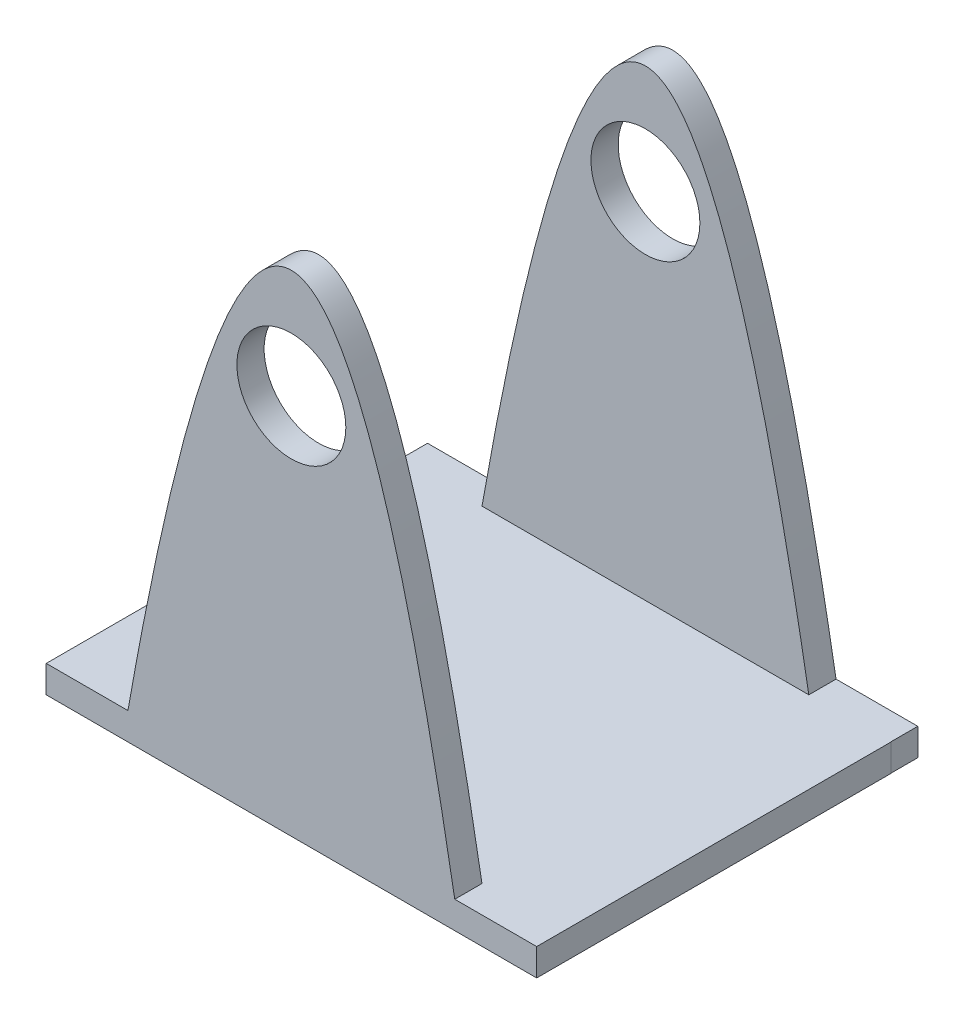
ISO-10303-21;
HEADER;
FILE_DESCRIPTION(('STEP AP214'),'2;1');
FILE_NAME('part.step','',(''),(''),'','','');
FILE_SCHEMA(('AUTOMOTIVE_DESIGN { 1 0 10303 214 1 1 1 1 }'));
ENDSEC;
DATA;
#1=APPLICATION_CONTEXT('core data for automotive mechanical design processes');
#2=APPLICATION_PROTOCOL_DEFINITION('international standard','automotive_design',2000,#1);
#3=PRODUCT_CONTEXT('',#1,'mechanical');
#4=PRODUCT('Part','Part','',(#3));
#5=PRODUCT_RELATED_PRODUCT_CATEGORY('part','',(#4));
#6=PRODUCT_DEFINITION_FORMATION('','',#4);
#7=PRODUCT_DEFINITION_CONTEXT('part definition',#1,'design');
#8=PRODUCT_DEFINITION('design','',#6,#7);
#9=PRODUCT_DEFINITION_SHAPE('','',#8);
#10=(LENGTH_UNIT() NAMED_UNIT(*) SI_UNIT(.MILLI.,.METRE.));
#11=(NAMED_UNIT(*) PLANE_ANGLE_UNIT() SI_UNIT($,.RADIAN.));
#12=(NAMED_UNIT(*) SI_UNIT($,.STERADIAN.) SOLID_ANGLE_UNIT());
#13=UNCERTAINTY_MEASURE_WITH_UNIT(LENGTH_MEASURE(1.E-05),#10,'distance_accuracy_value','');
#14=(GEOMETRIC_REPRESENTATION_CONTEXT(3) GLOBAL_UNCERTAINTY_ASSIGNED_CONTEXT((#13)) GLOBAL_UNIT_ASSIGNED_CONTEXT((#10,
#11,#12)) REPRESENTATION_CONTEXT('',''));
#15=CARTESIAN_POINT('',(0.,0.,0.));
#16=DIRECTION('',(0.,0.,1.));
#17=DIRECTION('',(1.,0.,0.));
#18=AXIS2_PLACEMENT_3D('',#15,#16,#17);
#19=CARTESIAN_POINT('',(-76.2,6.35,12.7));
#20=CARTESIAN_POINT('',(0.,438.15,12.7));
#21=CARTESIAN_POINT('',(76.2,6.35,12.7));
#22=B_SPLINE_CURVE_WITH_KNOTS('',2,(#19,#20,#21),.UNSPECIFIED.,.F.,.F.,(3,3),(0.,1.),.UNSPECIFIED.);
#23=DIRECTION('',(0.,0.,-1.));
#24=VECTOR('',#23,1.);
#25=SURFACE_OF_LINEAR_EXTRUSION('',#22,#24);
#26=CARTESIAN_POINT('',(-76.2,6.35,0.));
#27=CARTESIAN_POINT('',(0.,438.15,0.));
#28=CARTESIAN_POINT('',(76.2,6.35,0.));
#29=B_SPLINE_CURVE_WITH_KNOTS('',2,(#26,#27,#28),.UNSPECIFIED.,.F.,.F.,(3,3),(0.,1.),.UNSPECIFIED.);
#30=CARTESIAN_POINT('',(-76.2,6.35,0.));
#31=VERTEX_POINT('',#30);
#32=CARTESIAN_POINT('',(76.2,6.35,0.));
#33=VERTEX_POINT('',#32);
#34=EDGE_CURVE('E326',#31,#33,#29,.T.);
#35=ORIENTED_EDGE('',*,*,#34,.F.);
#36=DIRECTION('',(0.,0.,-1.));
#37=VECTOR('',#36,1.);
#38=CARTESIAN_POINT('',(-76.2,6.35,12.7));
#39=LINE('',#38,#37);
#40=CARTESIAN_POINT('',(-76.2,6.35,12.7));
#41=VERTEX_POINT('',#40);
#42=EDGE_CURVE('E347',#41,#31,#39,.T.);
#43=ORIENTED_EDGE('',*,*,#42,.F.);
#44=CARTESIAN_POINT('',(76.2,6.35,12.7));
#45=VERTEX_POINT('',#44);
#46=EDGE_CURVE('E209',#41,#45,#22,.T.);
#47=ORIENTED_EDGE('',*,*,#46,.T.);
#48=DIRECTION('',(0.,0.,-1.));
#49=VECTOR('',#48,1.);
#50=CARTESIAN_POINT('',(76.2,6.35,12.7));
#51=LINE('',#50,#49);
#52=EDGE_CURVE('E98',#45,#33,#51,.T.);
#53=ORIENTED_EDGE('',*,*,#52,.T.);
#54=EDGE_LOOP('',(#35,#43,#47,#53));
#55=FACE_BOUND('',#54,.T.);
#56=ADVANCED_FACE('F89',(#55),#25,.T.);
#57=CARTESIAN_POINT('',(0.,6.35000000000001,12.7));
#58=DIRECTION('',(0.,-1.,0.));
#59=DIRECTION('',(1.,0.,0.));
#60=AXIS2_PLACEMENT_3D('',#57,#58,#59);
#61=PLANE('',#60);
#62=DIRECTION('',(-1.,0.,0.));
#63=VECTOR('',#62,1.);
#64=CARTESIAN_POINT('',(0.,6.35000000000001,0.));
#65=LINE('',#64,#63);
#66=CARTESIAN_POINT('',(-114.3,6.35,0.));
#67=VERTEX_POINT('',#66);
#68=EDGE_CURVE('E331',#31,#67,#65,.T.);
#69=ORIENTED_EDGE('',*,*,#68,.T.);
#70=DIRECTION('',(0.,0.,-1.));
#71=VECTOR('',#70,1.);
#72=CARTESIAN_POINT('',(-114.3,6.35,12.7));
#73=LINE('',#72,#71);
#74=CARTESIAN_POINT('',(-114.3,6.35,177.8));
#75=VERTEX_POINT('',#74);
#76=EDGE_CURVE('E173',#75,#67,#73,.T.);
#77=ORIENTED_EDGE('',*,*,#76,.F.);
#78=DIRECTION('',(-1.,0.,0.));
#79=VECTOR('',#78,1.);
#80=CARTESIAN_POINT('',(-114.3,6.35,177.8));
#81=LINE('',#80,#79);
#82=CARTESIAN_POINT('',(-76.2,6.35,177.8));
#83=VERTEX_POINT('',#82);
#84=EDGE_CURVE('E166',#83,#75,#81,.T.);
#85=ORIENTED_EDGE('',*,*,#84,.F.);
#86=DIRECTION('',(0.,0.,-1.));
#87=VECTOR('',#86,1.);
#88=CARTESIAN_POINT('',(-76.2,6.35,177.8));
#89=LINE('',#88,#87);
#90=CARTESIAN_POINT('',(-76.2,6.35,165.1));
#91=VERTEX_POINT('',#90);
#92=EDGE_CURVE('E170',#83,#91,#89,.T.);
#93=ORIENTED_EDGE('',*,*,#92,.T.);
#94=DIRECTION('',(-1.,0.,0.));
#95=VECTOR('',#94,1.);
#96=CARTESIAN_POINT('',(-114.3,6.35,165.1));
#97=LINE('',#96,#95);
#98=CARTESIAN_POINT('',(76.2,6.35,165.1));
#99=VERTEX_POINT('',#98);
#100=EDGE_CURVE('E106',#99,#91,#97,.T.);
#101=ORIENTED_EDGE('',*,*,#100,.F.);
#102=DIRECTION('',(0.,0.,-1.));
#103=VECTOR('',#102,1.);
#104=CARTESIAN_POINT('',(76.2,6.35,177.8));
#105=LINE('',#104,#103);
#106=CARTESIAN_POINT('',(76.2,6.35,177.8));
#107=VERTEX_POINT('',#106);
#108=EDGE_CURVE('E192',#107,#99,#105,.T.);
#109=ORIENTED_EDGE('',*,*,#108,.F.);
#110=DIRECTION('',(-1.,0.,0.));
#111=VECTOR('',#110,1.);
#112=CARTESIAN_POINT('',(76.2,6.35,177.8));
#113=LINE('',#112,#111);
#114=CARTESIAN_POINT('',(114.402019181431,6.35,177.8));
#115=VERTEX_POINT('',#114);
#116=EDGE_CURVE('E185',#115,#107,#113,.T.);
#117=ORIENTED_EDGE('',*,*,#116,.F.);
#118=DIRECTION('',(0.,0.,-1.));
#119=VECTOR('',#118,1.);
#120=CARTESIAN_POINT('',(114.402019181431,6.35,165.1));
#121=LINE('',#120,#119);
#122=CARTESIAN_POINT('',(114.402019181431,6.35,12.7));
#123=VERTEX_POINT('',#122);
#124=EDGE_CURVE('E199',#115,#123,#121,.T.);
#125=ORIENTED_EDGE('',*,*,#124,.T.);
#126=DIRECTION('',(-1.,0.,0.));
#127=VECTOR('',#126,1.);
#128=CARTESIAN_POINT('',(-114.3,6.35,12.7));
#129=LINE('',#128,#127);
#130=CARTESIAN_POINT('',(114.3,6.35,12.7));
#131=VERTEX_POINT('',#130);
#132=EDGE_CURVE('E100',#123,#131,#129,.T.);
#133=ORIENTED_EDGE('',*,*,#132,.T.);
#134=DIRECTION('',(0.,0.,-1.));
#135=VECTOR('',#134,1.);
#136=CARTESIAN_POINT('',(114.3,6.35,12.7));
#137=LINE('',#136,#135);
#138=CARTESIAN_POINT('',(114.3,6.35,0.));
#139=VERTEX_POINT('',#138);
#140=EDGE_CURVE('E317',#131,#139,#137,.T.);
#141=ORIENTED_EDGE('',*,*,#140,.T.);
#142=DIRECTION('',(1.,0.,0.));
#143=VECTOR('',#142,1.);
#144=CARTESIAN_POINT('',(76.2,6.35,0.));
#145=LINE('',#144,#143);
#146=EDGE_CURVE('E319',#33,#139,#145,.T.);
#147=ORIENTED_EDGE('',*,*,#146,.F.);
#148=ORIENTED_EDGE('',*,*,#52,.F.);
#149=EDGE_CURVE('E14',#45,#41,#129,.T.);
#150=ORIENTED_EDGE('',*,*,#149,.T.);
#151=ORIENTED_EDGE('',*,*,#42,.T.);
#152=EDGE_LOOP('',(#69,#77,#85,#93,#101,#109,#117,#125,#133,#141,#147,#148,#150,#151));
#153=FACE_BOUND('',#152,.T.);
#154=ADVANCED_FACE('F168',(#153),#61,.F.);
#155=CARTESIAN_POINT('',(-114.3,0.,12.7));
#156=DIRECTION('',(1.,0.,0.));
#157=DIRECTION('',(0.,0.,-1.));
#158=AXIS2_PLACEMENT_3D('',#155,#156,#157);
#159=PLANE('',#158);
#160=DIRECTION('',(0.,-1.,0.));
#161=VECTOR('',#160,1.);
#162=CARTESIAN_POINT('',(-114.3,0.,0.));
#163=LINE('',#162,#161);
#164=CARTESIAN_POINT('',(-114.3,-6.35,0.));
#165=VERTEX_POINT('',#164);
#166=EDGE_CURVE('E332',#67,#165,#163,.T.);
#167=ORIENTED_EDGE('',*,*,#166,.T.);
#168=DIRECTION('',(0.,0.,-1.));
#169=VECTOR('',#168,1.);
#170=CARTESIAN_POINT('',(-114.3,-6.35,12.7));
#171=LINE('',#170,#169);
#172=CARTESIAN_POINT('',(-114.3,-6.35,177.8));
#173=VERTEX_POINT('',#172);
#174=EDGE_CURVE('E297',#173,#165,#171,.T.);
#175=ORIENTED_EDGE('',*,*,#174,.F.);
#176=DIRECTION('',(0.,-1.,0.));
#177=VECTOR('',#176,1.);
#178=CARTESIAN_POINT('',(-114.3,-6.35,177.8));
#179=LINE('',#178,#177);
#180=EDGE_CURVE('E177',#75,#173,#179,.T.);
#181=ORIENTED_EDGE('',*,*,#180,.F.);
#182=ORIENTED_EDGE('',*,*,#76,.T.);
#183=EDGE_LOOP('',(#167,#175,#181,#182));
#184=FACE_BOUND('',#183,.T.);
#185=ADVANCED_FACE('F226',(#184),#159,.F.);
#186=CARTESIAN_POINT('',(0.,-6.35,12.7));
#187=DIRECTION('',(0.,1.,0.));
#188=DIRECTION('',(0.,0.,1.));
#189=AXIS2_PLACEMENT_3D('',#186,#187,#188);
#190=PLANE('',#189);
#191=DIRECTION('',(1.,0.,0.));
#192=VECTOR('',#191,1.);
#193=CARTESIAN_POINT('',(0.,-6.35,0.));
#194=LINE('',#193,#192);
#195=CARTESIAN_POINT('',(114.3,-6.35,0.));
#196=VERTEX_POINT('',#195);
#197=EDGE_CURVE('E341',#165,#196,#194,.T.);
#198=ORIENTED_EDGE('',*,*,#197,.T.);
#199=DIRECTION('',(0.,0.,-1.));
#200=VECTOR('',#199,1.);
#201=CARTESIAN_POINT('',(114.3,-6.35,12.7));
#202=LINE('',#201,#200);
#203=CARTESIAN_POINT('',(114.3,-6.35,12.7));
#204=VERTEX_POINT('',#203);
#205=EDGE_CURVE('E93',#204,#196,#202,.T.);
#206=ORIENTED_EDGE('',*,*,#205,.F.);
#207=DIRECTION('',(1.,0.,0.));
#208=VECTOR('',#207,1.);
#209=CARTESIAN_POINT('',(-114.3,-6.35,12.7));
#210=LINE('',#209,#208);
#211=CARTESIAN_POINT('',(114.402019181431,-6.35,12.7));
#212=VERTEX_POINT('',#211);
#213=EDGE_CURVE('E191',#204,#212,#210,.T.);
#214=ORIENTED_EDGE('',*,*,#213,.T.);
#215=DIRECTION('',(0.,0.,-1.));
#216=VECTOR('',#215,1.);
#217=CARTESIAN_POINT('',(114.402019181431,-6.35,165.1));
#218=LINE('',#217,#216);
#219=CARTESIAN_POINT('',(114.402019181431,-6.35,177.8));
#220=VERTEX_POINT('',#219);
#221=EDGE_CURVE('E205',#220,#212,#218,.T.);
#222=ORIENTED_EDGE('',*,*,#221,.F.);
#223=DIRECTION('',(1.,0.,0.));
#224=VECTOR('',#223,1.);
#225=CARTESIAN_POINT('',(114.402019181431,-6.35,177.8));
#226=LINE('',#225,#224);
#227=EDGE_CURVE('E292',#173,#220,#226,.T.);
#228=ORIENTED_EDGE('',*,*,#227,.F.);
#229=ORIENTED_EDGE('',*,*,#174,.T.);
#230=EDGE_LOOP('',(#198,#206,#214,#222,#228,#229));
#231=FACE_BOUND('',#230,.T.);
#232=ADVANCED_FACE('F229',(#231),#190,.F.);
#233=CARTESIAN_POINT('',(0.,171.45,12.7));
#234=DIRECTION('',(0.,0.,-1.));
#235=DIRECTION('',(-1.,0.,0.));
#236=AXIS2_PLACEMENT_3D('',#233,#234,#235);
#237=CYLINDRICAL_SURFACE('',#236,25.4);
#238=CARTESIAN_POINT('',(0.,171.45,12.7));
#239=DIRECTION('',(0.,0.,1.));
#240=DIRECTION('',(1.,0.,0.));
#241=AXIS2_PLACEMENT_3D('',#238,#239,#240);
#242=CIRCLE('',#241,25.4);
#243=CARTESIAN_POINT('',(25.4,171.45,12.7));
#244=VERTEX_POINT('',#243);
#245=EDGE_CURVE('E215',#244,#244,#242,.T.);
#246=ORIENTED_EDGE('',*,*,#245,.T.);
#247=EDGE_LOOP('',(#246));
#248=FACE_BOUND('',#247,.T.);
#249=CARTESIAN_POINT('',(0.,171.45,0.));
#250=DIRECTION('',(0.,0.,1.));
#251=DIRECTION('',(1.,0.,0.));
#252=AXIS2_PLACEMENT_3D('',#249,#250,#251);
#253=CIRCLE('',#252,25.4);
#254=CARTESIAN_POINT('',(25.4,171.45,0.));
#255=VERTEX_POINT('',#254);
#256=EDGE_CURVE('E216',#255,#255,#253,.T.);
#257=ORIENTED_EDGE('',*,*,#256,.F.);
#258=EDGE_LOOP('',(#257));
#259=FACE_BOUND('',#258,.T.);
#260=ADVANCED_FACE('F233',(#248,#259),#237,.F.);
#261=CARTESIAN_POINT('',(0.,0.,12.7));
#262=DIRECTION('',(0.,0.,1.));
#263=DIRECTION('',(1.,0.,0.));
#264=AXIS2_PLACEMENT_3D('',#261,#262,#263);
#265=PLANE('',#264);
#266=ORIENTED_EDGE('',*,*,#149,.F.);
#267=ORIENTED_EDGE('',*,*,#46,.F.);
#268=EDGE_LOOP('',(#266,#267));
#269=FACE_BOUND('',#268,.T.);
#270=ORIENTED_EDGE('',*,*,#245,.F.);
#271=EDGE_LOOP('',(#270));
#272=FACE_BOUND('',#271,.T.);
#273=ADVANCED_FACE('F237',(#269,#272),#265,.T.);
#274=CARTESIAN_POINT('',(0.,0.,0.));
#275=DIRECTION('',(0.,0.,1.));
#276=DIRECTION('',(1.,0.,0.));
#277=AXIS2_PLACEMENT_3D('',#274,#275,#276);
#278=PLANE('',#277);
#279=ORIENTED_EDGE('',*,*,#34,.T.);
#280=ORIENTED_EDGE('',*,*,#146,.T.);
#281=DIRECTION('',(0.,-1.,0.));
#282=VECTOR('',#281,1.);
#283=CARTESIAN_POINT('',(114.3,6.35,0.));
#284=LINE('',#283,#282);
#285=EDGE_CURVE('E208',#139,#196,#284,.T.);
#286=ORIENTED_EDGE('',*,*,#285,.T.);
#287=ORIENTED_EDGE('',*,*,#197,.F.);
#288=ORIENTED_EDGE('',*,*,#166,.F.);
#289=ORIENTED_EDGE('',*,*,#68,.F.);
#290=EDGE_LOOP('',(#279,#280,#286,#287,#288,#289));
#291=FACE_BOUND('',#290,.T.);
#292=ORIENTED_EDGE('',*,*,#256,.T.);
#293=EDGE_LOOP('',(#292));
#294=FACE_BOUND('',#293,.T.);
#295=ADVANCED_FACE('F239',(#291,#294),#278,.F.);
#296=CARTESIAN_POINT('',(114.3,6.35,12.7));
#297=DIRECTION('',(1.,0.,0.));
#298=DIRECTION('',(0.,0.,-1.));
#299=AXIS2_PLACEMENT_3D('',#296,#297,#298);
#300=PLANE('',#299);
#301=ORIENTED_EDGE('',*,*,#285,.F.);
#302=ORIENTED_EDGE('',*,*,#140,.F.);
#303=DIRECTION('',(0.,-1.,0.));
#304=VECTOR('',#303,1.);
#305=CARTESIAN_POINT('',(114.3,6.35,12.7));
#306=LINE('',#305,#304);
#307=EDGE_CURVE('E328',#131,#204,#306,.T.);
#308=ORIENTED_EDGE('',*,*,#307,.T.);
#309=ORIENTED_EDGE('',*,*,#205,.T.);
#310=EDGE_LOOP('',(#301,#302,#308,#309));
#311=FACE_BOUND('',#310,.T.);
#312=ADVANCED_FACE('F91',(#311),#300,.T.);
#313=CARTESIAN_POINT('',(114.402019181431,-6.35,165.1));
#314=DIRECTION('',(-1.,0.,0.));
#315=DIRECTION('',(0.,0.,1.));
#316=AXIS2_PLACEMENT_3D('',#313,#314,#315);
#317=PLANE('',#316);
#318=DIRECTION('',(0.,1.,0.));
#319=VECTOR('',#318,1.);
#320=CARTESIAN_POINT('',(114.402019181431,-6.35,12.7));
#321=LINE('',#320,#319);
#322=EDGE_CURVE('E194',#212,#123,#321,.T.);
#323=ORIENTED_EDGE('',*,*,#322,.T.);
#324=ORIENTED_EDGE('',*,*,#124,.F.);
#325=DIRECTION('',(0.,1.,0.));
#326=VECTOR('',#325,1.);
#327=CARTESIAN_POINT('',(114.402019181431,6.35,177.8));
#328=LINE('',#327,#326);
#329=EDGE_CURVE('E290',#220,#115,#328,.T.);
#330=ORIENTED_EDGE('',*,*,#329,.F.);
#331=ORIENTED_EDGE('',*,*,#221,.T.);
#332=EDGE_LOOP('',(#323,#324,#330,#331));
#333=FACE_BOUND('',#332,.T.);
#334=ADVANCED_FACE('F243',(#333),#317,.F.);
#335=CARTESIAN_POINT('',(0.,0.,12.7));
#336=DIRECTION('',(0.,0.,1.));
#337=DIRECTION('',(1.,0.,0.));
#338=AXIS2_PLACEMENT_3D('',#335,#336,#337);
#339=PLANE('',#338);
#340=ORIENTED_EDGE('',*,*,#307,.F.);
#341=ORIENTED_EDGE('',*,*,#132,.F.);
#342=ORIENTED_EDGE('',*,*,#322,.F.);
#343=ORIENTED_EDGE('',*,*,#213,.F.);
#344=EDGE_LOOP('',(#340,#341,#342,#343));
#345=FACE_BOUND('',#344,.T.);
#346=ADVANCED_FACE('F249',(#345),#339,.F.);
#347=CARTESIAN_POINT('',(4.16333634234434E-12,222.250000000003,165.1));
#348=DIRECTION('',(0.,0.,1.));
#349=DIRECTION('',(1.,0.,0.));
#350=AXIS2_PLACEMENT_3D('',#347,#348,#349);
#351=PLANE('',#350);
#352=CARTESIAN_POINT('',(0.,171.45,165.1));
#353=DIRECTION('',(0.,0.,1.));
#354=DIRECTION('',(1.,0.,0.));
#355=AXIS2_PLACEMENT_3D('',#352,#353,#354);
#356=CIRCLE('',#355,25.4);
#357=CARTESIAN_POINT('',(25.4,171.45,165.1));
#358=VERTEX_POINT('',#357);
#359=EDGE_CURVE('E263',#358,#358,#356,.T.);
#360=ORIENTED_EDGE('',*,*,#359,.T.);
#361=EDGE_LOOP('',(#360));
#362=FACE_BOUND('',#361,.T.);
#363=CARTESIAN_POINT('',(76.2,6.35,165.1));
#364=CARTESIAN_POINT('',(8.3318768551166E-12,438.150000000005,165.1));
#365=CARTESIAN_POINT('',(-76.2,6.35,165.1));
#366=B_SPLINE_CURVE_WITH_KNOTS('',2,(#363,#364,#365),.UNSPECIFIED.,.F.,.F.,(3,3),(0.,1.),.UNSPECIFIED.);
#367=EDGE_CURVE('E188',#99,#91,#366,.T.);
#368=ORIENTED_EDGE('',*,*,#367,.F.);
#369=ORIENTED_EDGE('',*,*,#100,.T.);
#370=EDGE_LOOP('',(#368,#369));
#371=FACE_BOUND('',#370,.T.);
#372=ADVANCED_FACE('F253',(#362,#371),#351,.F.);
#373=CARTESIAN_POINT('',(4.16333634234434E-12,222.250000000003,177.8));
#374=DIRECTION('',(0.,0.,1.));
#375=DIRECTION('',(1.,0.,0.));
#376=AXIS2_PLACEMENT_3D('',#373,#374,#375);
#377=PLANE('',#376);
#378=CARTESIAN_POINT('',(76.2,6.35,177.8));
#379=CARTESIAN_POINT('',(8.3318768551166E-12,438.150000000005,177.8));
#380=CARTESIAN_POINT('',(-76.2,6.35,177.8));
#381=B_SPLINE_CURVE_WITH_KNOTS('',2,(#378,#379,#380),.UNSPECIFIED.,.F.,.F.,(3,3),(0.,1.),.UNSPECIFIED.);
#382=EDGE_CURVE('E178',#107,#83,#381,.T.);
#383=ORIENTED_EDGE('',*,*,#382,.T.);
#384=ORIENTED_EDGE('',*,*,#84,.T.);
#385=ORIENTED_EDGE('',*,*,#180,.T.);
#386=ORIENTED_EDGE('',*,*,#227,.T.);
#387=ORIENTED_EDGE('',*,*,#329,.T.);
#388=ORIENTED_EDGE('',*,*,#116,.T.);
#389=EDGE_LOOP('',(#383,#384,#385,#386,#387,#388));
#390=FACE_BOUND('',#389,.T.);
#391=CARTESIAN_POINT('',(0.,171.45,177.8));
#392=DIRECTION('',(0.,0.,1.));
#393=DIRECTION('',(1.,0.,0.));
#394=AXIS2_PLACEMENT_3D('',#391,#392,#393);
#395=CIRCLE('',#394,25.4);
#396=CARTESIAN_POINT('',(25.4,171.45,177.8));
#397=VERTEX_POINT('',#396);
#398=EDGE_CURVE('E285',#397,#397,#395,.T.);
#399=ORIENTED_EDGE('',*,*,#398,.F.);
#400=EDGE_LOOP('',(#399));
#401=FACE_BOUND('',#400,.T.);
#402=ADVANCED_FACE('F181',(#390,#401),#377,.T.);
#403=DIRECTION('',(0.,0.,-1.));
#404=VECTOR('',#403,1.);
#405=SURFACE_OF_LINEAR_EXTRUSION('',#381,#404);
#406=ORIENTED_EDGE('',*,*,#367,.T.);
#407=ORIENTED_EDGE('',*,*,#92,.F.);
#408=ORIENTED_EDGE('',*,*,#382,.F.);
#409=ORIENTED_EDGE('',*,*,#108,.T.);
#410=EDGE_LOOP('',(#406,#407,#408,#409));
#411=FACE_BOUND('',#410,.T.);
#412=ADVANCED_FACE('F190',(#411),#405,.F.);
#413=CARTESIAN_POINT('',(0.,171.45,177.8));
#414=DIRECTION('',(0.,0.,-1.));
#415=DIRECTION('',(-1.,0.,0.));
#416=AXIS2_PLACEMENT_3D('',#413,#414,#415);
#417=CYLINDRICAL_SURFACE('',#416,25.4);
#418=ORIENTED_EDGE('',*,*,#398,.T.);
#419=EDGE_LOOP('',(#418));
#420=FACE_BOUND('',#419,.T.);
#421=ORIENTED_EDGE('',*,*,#359,.F.);
#422=EDGE_LOOP('',(#421));
#423=FACE_BOUND('',#422,.T.);
#424=ADVANCED_FACE('F257',(#420,#423),#417,.F.);
#425=CLOSED_SHELL('',(#56,#154,#185,#232,#260,#273,#295,#312,#334,#346,#372,#402,#412,#424));
#426=MANIFOLD_SOLID_BREP('B2',#425);
#427=ADVANCED_BREP_SHAPE_REPRESENTATION('',(#18,#426),#14);
#428=SHAPE_DEFINITION_REPRESENTATION(#9,#427);
ENDSEC;
END-ISO-10303-21;
